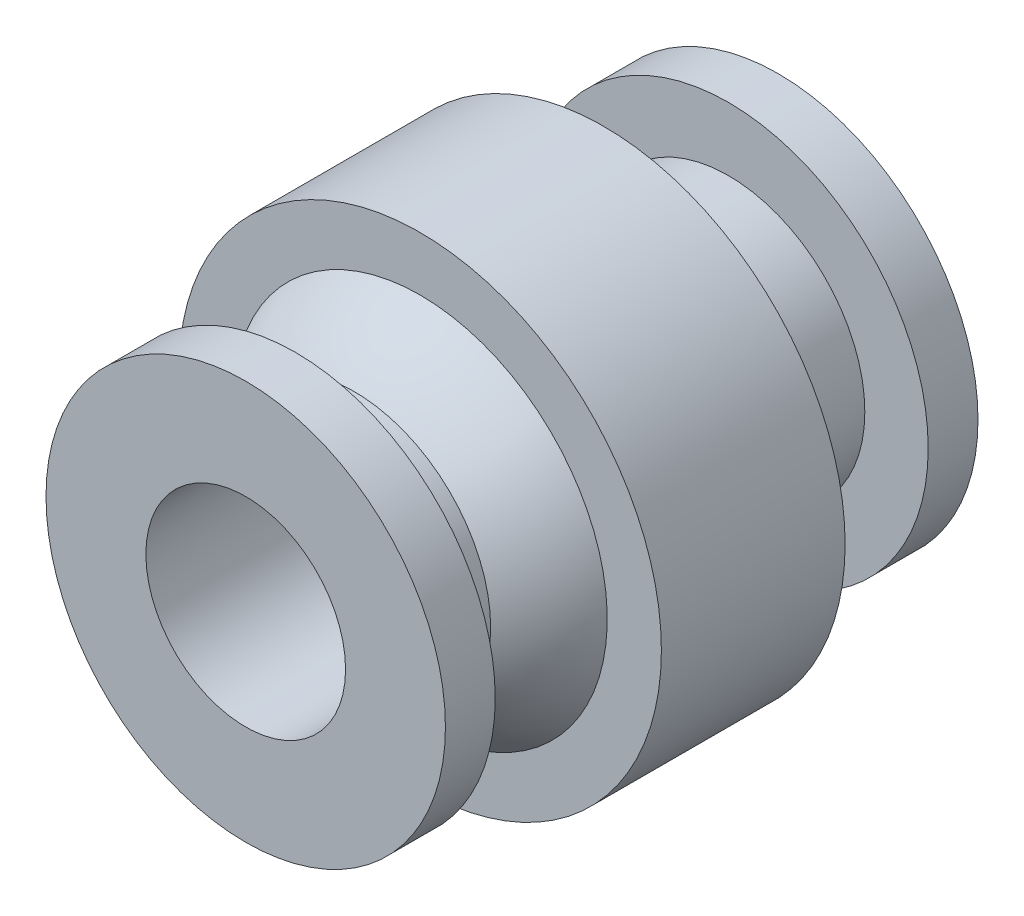
ISO-10303-21;
HEADER;
FILE_DESCRIPTION(('STEP AP214'),'2;1');
FILE_NAME('part.step','',(''),(''),'','','');
FILE_SCHEMA(('AUTOMOTIVE_DESIGN { 1 0 10303 214 1 1 1 1 }'));
ENDSEC;
DATA;
#1=APPLICATION_CONTEXT('core data for automotive mechanical design processes');
#2=APPLICATION_PROTOCOL_DEFINITION('international standard','automotive_design',2000,#1);
#3=PRODUCT_CONTEXT('',#1,'mechanical');
#4=PRODUCT('Part','Part','',(#3));
#5=PRODUCT_RELATED_PRODUCT_CATEGORY('part','',(#4));
#6=PRODUCT_DEFINITION_FORMATION('','',#4);
#7=PRODUCT_DEFINITION_CONTEXT('part definition',#1,'design');
#8=PRODUCT_DEFINITION('design','',#6,#7);
#9=PRODUCT_DEFINITION_SHAPE('','',#8);
#10=(LENGTH_UNIT() NAMED_UNIT(*) SI_UNIT(.MILLI.,.METRE.));
#11=(NAMED_UNIT(*) PLANE_ANGLE_UNIT() SI_UNIT($,.RADIAN.));
#12=(NAMED_UNIT(*) SI_UNIT($,.STERADIAN.) SOLID_ANGLE_UNIT());
#13=UNCERTAINTY_MEASURE_WITH_UNIT(LENGTH_MEASURE(1.E-05),#10,'distance_accuracy_value','');
#14=(GEOMETRIC_REPRESENTATION_CONTEXT(3) GLOBAL_UNCERTAINTY_ASSIGNED_CONTEXT((#13)) GLOBAL_UNIT_ASSIGNED_CONTEXT((#10,
#11,#12)) REPRESENTATION_CONTEXT('',''));
#15=CARTESIAN_POINT('',(0.,0.,0.));
#16=DIRECTION('',(0.,0.,1.));
#17=DIRECTION('',(1.,0.,0.));
#18=AXIS2_PLACEMENT_3D('',#15,#16,#17);
#19=CARTESIAN_POINT('',(0.,-31.574232,-60.7949));
#20=DIRECTION('',(0.,0.,-1.));
#21=DIRECTION('',(-1.,0.,0.));
#22=AXIS2_PLACEMENT_3D('',#19,#20,#21);
#23=PLANE('',#22);
#24=CARTESIAN_POINT('',(0.,-22.049232,-60.7949));
#25=DIRECTION('',(0.,0.,1.));
#26=DIRECTION('',(1.,0.,0.));
#27=AXIS2_PLACEMENT_3D('',#24,#25,#26);
#28=CIRCLE('',#27,6.5024);
#29=CARTESIAN_POINT('',(6.5024,-22.049232,-60.7949));
#30=VERTEX_POINT('',#29);
#31=EDGE_CURVE('E10',#30,#30,#28,.T.);
#32=ORIENTED_EDGE('',*,*,#31,.T.);
#33=EDGE_LOOP('',(#32));
#34=FACE_BOUND('',#33,.T.);
#35=CARTESIAN_POINT('',(0.,-22.049232,-60.7949));
#36=DIRECTION('',(0.,0.,1.));
#37=DIRECTION('',(1.,0.,0.));
#38=AXIS2_PLACEMENT_3D('',#35,#36,#37);
#39=CIRCLE('',#38,9.525);
#40=CARTESIAN_POINT('',(9.525,-22.049232,-60.7949));
#41=VERTEX_POINT('',#40);
#42=EDGE_CURVE('E84',#41,#41,#39,.T.);
#43=ORIENTED_EDGE('',*,*,#42,.F.);
#44=EDGE_LOOP('',(#43));
#45=FACE_BOUND('',#44,.T.);
#46=ADVANCED_FACE('F38',(#34,#45),#23,.T.);
#47=CARTESIAN_POINT('',(0.,-22.049232,-82.1361730867633));
#48=DIRECTION('',(0.,0.,1.));
#49=DIRECTION('',(1.,0.,0.));
#50=AXIS2_PLACEMENT_3D('',#47,#48,#49);
#51=CYLINDRICAL_SURFACE('',#50,6.5024);
#52=CARTESIAN_POINT('',(0.,-22.049232,-63.6000069614774));
#53=DIRECTION('',(0.,0.,1.));
#54=DIRECTION('',(1.,0.,0.));
#55=AXIS2_PLACEMENT_3D('',#52,#53,#54);
#56=CIRCLE('',#55,6.5024);
#57=CARTESIAN_POINT('',(0.,-28.551632,-63.6000069614774));
#58=VERTEX_POINT('',#57);
#59=EDGE_CURVE('E44',#58,#58,#56,.T.);
#60=ORIENTED_EDGE('',*,*,#59,.T.);
#61=EDGE_LOOP('',(#60));
#62=FACE_BOUND('',#61,.T.);
#63=ORIENTED_EDGE('',*,*,#31,.F.);
#64=EDGE_LOOP('',(#63));
#65=FACE_BOUND('',#64,.T.);
#66=ADVANCED_FACE('F92',(#62,#65),#51,.T.);
#67=CARTESIAN_POINT('',(0.,-22.049232,-71.12));
#68=DIRECTION('',(0.,0.,1.));
#69=DIRECTION('',(0.,-1.,0.));
#70=AXIS2_PLACEMENT_3D('',#67,#68,#69);
#71=SPHERICAL_SURFACE('',#70,9.94140337474685);
#72=CARTESIAN_POINT('',(0.,-22.049232,-66.7385));
#73=DIRECTION('',(0.,0.,1.));
#74=DIRECTION('',(1.,0.,0.));
#75=AXIS2_PLACEMENT_3D('',#72,#73,#74);
#76=CIRCLE('',#75,8.92378612526253);
#77=CARTESIAN_POINT('',(0.,-30.9730181252625,-66.7385));
#78=VERTEX_POINT('',#77);
#79=EDGE_CURVE('E48',#78,#78,#76,.T.);
#80=CARTESIAN_POINT('',(0.,-30.9730181252625,-66.7385));
#81=CARTESIAN_POINT('',(0.,-30.9546968172942,-66.7011850210384));
#82=CARTESIAN_POINT('',(0.,-30.9361414336475,-66.6639849715197));
#83=CARTESIAN_POINT('',(0.,-30.8985654926746,-66.5898205560576));
#84=CARTESIAN_POINT('',(0.,-30.8795449353484,-66.5528561901143));
#85=CARTESIAN_POINT('',(0.,-30.8410416246939,-66.4791689664927));
#86=CARTESIAN_POINT('',(0.,-30.8215588713656,-66.4424461088144));
#87=CARTESIAN_POINT('',(0.,-30.7821342387314,-66.3692476784703));
#88=CARTESIAN_POINT('',(0.,-30.7621923594254,-66.3327721058044));
#89=CARTESIAN_POINT('',(0.,-30.7218526118547,-66.2600739859813));
#90=CARTESIAN_POINT('',(0.,-30.7014547435899,-66.2238514388242));
#91=CARTESIAN_POINT('',(0.,-30.6602062282843,-66.1516650699845));
#92=CARTESIAN_POINT('',(0.,-30.6393555812437,-66.115701248302));
#93=CARTESIAN_POINT('',(0.,-30.5972047894432,-66.0440379898545));
#94=CARTESIAN_POINT('',(0.,-30.5759046446834,-66.0083385530896));
#95=CARTESIAN_POINT('',(0.,-30.5328582093371,-65.9372096822646));
#96=CARTESIAN_POINT('',(0.,-30.5111119187507,-65.9017802482044));
#97=CARTESIAN_POINT('',(0.,-30.4671766138237,-65.8311969581013));
#98=CARTESIAN_POINT('',(0.,-30.4449875994832,-65.7960431020582));
#99=CARTESIAN_POINT('',(0.,-30.4001703387966,-65.7260164999317));
#100=CARTESIAN_POINT('',(0.,-30.3775420924505,-65.6911437538483));
#101=CARTESIAN_POINT('',(0.,-30.3318499286185,-65.6216848593482));
#102=CARTESIAN_POINT('',(0.,-30.3087860111326,-65.5870987109315));
#103=CARTESIAN_POINT('',(0.,-30.2622261344462,-65.5182184543714));
#104=CARTESIAN_POINT('',(0.,-30.2387301752457,-65.4839243462281));
#105=CARTESIAN_POINT('',(0.,-30.1913099125428,-65.4156335668651));
#106=CARTESIAN_POINT('',(0.,-30.1673856090403,-65.3816368956454));
#107=CARTESIAN_POINT('',(0.,-30.1191124225522,-65.3139463399739));
#108=CARTESIAN_POINT('',(0.,-30.0947635395665,-65.2802524555222));
#109=CARTESIAN_POINT('',(0.,-30.0456450257438,-65.2131727755835));
#110=CARTESIAN_POINT('',(0.,-30.0208753949069,-65.1797869800965));
#111=CARTESIAN_POINT('',(0.,-29.9709192832243,-65.1133287318019));
#112=CARTESIAN_POINT('',(0.,-29.9457328023786,-65.0802562789943));
#113=CARTESIAN_POINT('',(0.,-29.8949469541182,-65.0144299204645));
#114=CARTESIAN_POINT('',(0.,-29.8693475867035,-64.9816760147422));
#115=CARTESIAN_POINT('',(0.,-29.8177399937179,-64.9164919046612));
#116=CARTESIAN_POINT('',(0.,-29.7917317681471,-64.8840617003024));
#117=CARTESIAN_POINT('',(0.,-29.7393105516018,-64.8195300962874));
#118=CARTESIAN_POINT('',(0.,-29.7128975606273,-64.7874286966313));
#119=CARTESIAN_POINT('',(0.,-29.6596709697226,-64.7235597536191));
#120=CARTESIAN_POINT('',(0.,-29.6328573697924,-64.6917922102631));
#121=CARTESIAN_POINT('',(0.,-29.5788337804654,-64.6285959789114));
#122=CARTESIAN_POINT('',(0.,-29.5516237910686,-64.5971672909158));
#123=CARTESIAN_POINT('',(0.,-29.4968117046751,-64.5346537160218));
#124=CARTESIAN_POINT('',(0.,-29.4692096076784,-64.5035688291235));
#125=CARTESIAN_POINT('',(0.,-29.4136176496549,-64.4417477480594));
#126=CARTESIAN_POINT('',(0.,-29.3856277886281,-64.4110115538935));
#127=CARTESIAN_POINT('',(0.,-29.3292647071351,-64.3498926950573));
#128=CARTESIAN_POINT('',(0.,-29.3008914866688,-64.319510030387));
#129=CARTESIAN_POINT('',(0.,-29.2437661512124,-64.2591030116738));
#130=CARTESIAN_POINT('',(0.,-29.2150140362224,-64.229078657631));
#131=CARTESIAN_POINT('',(0.,-29.157135436264,-64.1693929849136));
#132=CARTESIAN_POINT('',(0.,-29.1280089512957,-64.139731666239));
#133=CARTESIAN_POINT('',(0.,-29.0693861948185,-64.0807767318931));
#134=CARTESIAN_POINT('',(0.,-29.0398899233096,-64.0514831162218));
#135=CARTESIAN_POINT('',(0.,-28.980532235455,-63.9932681975692));
#136=CARTESIAN_POINT('',(0.,-28.9506708191094,-63.964346894588));
#137=CARTESIAN_POINT('',(0.,-28.890587540465,-63.9068811527306));
#138=CARTESIAN_POINT('',(0.,-28.8603656781663,-63.8783367138544));
#139=CARTESIAN_POINT('',(0.,-28.7995662642682,-63.8216291911362));
#140=CARTESIAN_POINT('',(0.,-28.7689887126688,-63.7934661072941));
#141=CARTESIAN_POINT('',(0.,-28.7074827288851,-63.7375257299696));
#142=CARTESIAN_POINT('',(0.,-28.6765542967007,-63.7097484364872));
#143=CARTESIAN_POINT('',(0.,-28.6143514302681,-63.6545839980472));
#144=CARTESIAN_POINT('',(0.,-28.5830769960198,-63.6271968530898));
#145=CARTESIAN_POINT('',(0.,-28.551632,-63.6000069614774));
#146=B_SPLINE_CURVE_WITH_KNOTS('',3,(#80,#81,#82,#83,#84,#85,#86,#87,#88,#89,#90,#91,#92,#93,
#94,#95,#96,#97,#98,#99,#100,#101,#102,#103,#104,#105,#106,#107,#108,#109,#110,#111,#112,#113,
#114,#115,#116,#117,#118,#119,#120,#121,#122,#123,#124,#125,#126,#127,#128,#129,#130,#131,#132,
#133,#134,#135,#136,#137,#138,#139,#140,#141,#142,#143,#144,#145),.UNSPECIFIED.,.F.,.F.,(4,2,2,
2,2,2,2,2,2,2,2,2,2,2,2,2,2,2,2,2,2,2,2,2,2,2,2,2,2,2,2,2,4),(0.,0.124709653743761,
0.249419307487528,0.374128961231285,0.49883861497504,0.62354826871879,0.748257922462551,
0.872967576206311,0.997677229950065,1.12238688369382,1.24709653743757,1.37180619118134,
1.49651584492509,1.62122549866885,1.74593515241261,1.87064480615637,1.99535445990012,
2.12006411364388,2.24477376738763,2.3694834211314,2.49419307487515,2.61890272861891,
2.74361238236267,2.86832203610643,2.99303168985017,3.11774134359393,3.24245099733769,
3.36716065108145,3.4918703048252,3.61657995856896,3.74128961231272,3.86599926605648,
3.99070891980024),.UNSPECIFIED.);
#147=EDGE_CURVE('BSEAM95',#78,#58,#146,.T.);
#148=ORIENTED_EDGE('',*,*,#79,.T.);
#149=ORIENTED_EDGE('',*,*,#59,.F.);
#150=ORIENTED_EDGE('',*,*,#147,.T.);
#151=ORIENTED_EDGE('',*,*,#147,.F.);
#152=EDGE_LOOP('',(#148,#150,#149,#151));
#153=FACE_BOUND('',#152,.T.);
#154=ADVANCED_FACE('F95',(#153),#71,.T.);
#155=CARTESIAN_POINT('',(0.,-30.9730181252625,-66.7385));
#156=DIRECTION('',(0.,0.,1.));
#157=DIRECTION('',(1.,0.,0.));
#158=AXIS2_PLACEMENT_3D('',#155,#156,#157);
#159=PLANE('',#158);
#160=CARTESIAN_POINT('',(0.,-22.049232,-66.7385));
#161=DIRECTION('',(0.,0.,1.));
#162=DIRECTION('',(1.,0.,0.));
#163=AXIS2_PLACEMENT_3D('',#160,#161,#162);
#164=CIRCLE('',#163,11.5062);
#165=CARTESIAN_POINT('',(11.5062,-22.049232,-66.7385));
#166=VERTEX_POINT('',#165);
#167=EDGE_CURVE('E52',#166,#166,#164,.T.);
#168=ORIENTED_EDGE('',*,*,#167,.T.);
#169=EDGE_LOOP('',(#168));
#170=FACE_BOUND('',#169,.T.);
#171=ORIENTED_EDGE('',*,*,#79,.F.);
#172=EDGE_LOOP('',(#171));
#173=FACE_BOUND('',#172,.T.);
#174=ADVANCED_FACE('F98',(#170,#173),#159,.T.);
#175=CARTESIAN_POINT('',(0.,-22.049232,-82.1361730867633));
#176=DIRECTION('',(0.,0.,1.));
#177=DIRECTION('',(1.,0.,0.));
#178=AXIS2_PLACEMENT_3D('',#175,#176,#177);
#179=CYLINDRICAL_SURFACE('',#178,11.5062);
#180=CARTESIAN_POINT('',(0.,-22.049232,-75.5015));
#181=DIRECTION('',(0.,0.,1.));
#182=DIRECTION('',(1.,0.,0.));
#183=AXIS2_PLACEMENT_3D('',#180,#181,#182);
#184=CIRCLE('',#183,11.5062);
#185=CARTESIAN_POINT('',(11.5062,-22.049232,-75.5015));
#186=VERTEX_POINT('',#185);
#187=EDGE_CURVE('E57',#186,#186,#184,.T.);
#188=ORIENTED_EDGE('',*,*,#187,.T.);
#189=EDGE_LOOP('',(#188));
#190=FACE_BOUND('',#189,.T.);
#191=ORIENTED_EDGE('',*,*,#167,.F.);
#192=EDGE_LOOP('',(#191));
#193=FACE_BOUND('',#192,.T.);
#194=ADVANCED_FACE('F105',(#190,#193),#179,.T.);
#195=CARTESIAN_POINT('',(0.,-33.555432,-75.5015));
#196=DIRECTION('',(0.,0.,-1.));
#197=DIRECTION('',(-1.,0.,0.));
#198=AXIS2_PLACEMENT_3D('',#195,#196,#197);
#199=PLANE('',#198);
#200=CARTESIAN_POINT('',(0.,-22.049232,-75.5015));
#201=DIRECTION('',(0.,0.,1.));
#202=DIRECTION('',(1.,0.,0.));
#203=AXIS2_PLACEMENT_3D('',#200,#201,#202);
#204=CIRCLE('',#203,8.92378612526253);
#205=CARTESIAN_POINT('',(0.,-30.9730181252625,-75.5015));
#206=VERTEX_POINT('',#205);
#207=EDGE_CURVE('E60',#206,#206,#204,.T.);
#208=ORIENTED_EDGE('',*,*,#207,.T.);
#209=EDGE_LOOP('',(#208));
#210=FACE_BOUND('',#209,.T.);
#211=ORIENTED_EDGE('',*,*,#187,.F.);
#212=EDGE_LOOP('',(#211));
#213=FACE_BOUND('',#212,.T.);
#214=ADVANCED_FACE('F109',(#210,#213),#199,.T.);
#215=CARTESIAN_POINT('',(0.,-22.049232,-71.12));
#216=DIRECTION('',(0.,0.,1.));
#217=DIRECTION('',(0.,-1.,0.));
#218=AXIS2_PLACEMENT_3D('',#215,#216,#217);
#219=SPHERICAL_SURFACE('',#218,9.94140337474685);
#220=CARTESIAN_POINT('',(0.,-22.049232,-78.6399930385226));
#221=DIRECTION('',(0.,0.,1.));
#222=DIRECTION('',(1.,0.,0.));
#223=AXIS2_PLACEMENT_3D('',#220,#221,#222);
#224=CIRCLE('',#223,6.5024);
#225=CARTESIAN_POINT('',(0.,-28.551632,-78.6399930385226));
#226=VERTEX_POINT('',#225);
#227=EDGE_CURVE('E63',#226,#226,#224,.T.);
#228=CARTESIAN_POINT('',(0.,-28.551632,-78.6399930385226));
#229=CARTESIAN_POINT('',(0.,-28.5830769960198,-78.6128031469102));
#230=CARTESIAN_POINT('',(0.,-28.6143514302681,-78.5854160019528));
#231=CARTESIAN_POINT('',(0.,-28.6765542967007,-78.5302515635128));
#232=CARTESIAN_POINT('',(0.,-28.707482728885,-78.5024742700304));
#233=CARTESIAN_POINT('',(0.,-28.7689887126688,-78.4465338927059));
#234=CARTESIAN_POINT('',(0.,-28.7995662642682,-78.4183708088638));
#235=CARTESIAN_POINT('',(0.,-28.8603656781663,-78.3616632861455));
#236=CARTESIAN_POINT('',(0.,-28.890587540465,-78.3331188472694));
#237=CARTESIAN_POINT('',(0.,-28.9506708191094,-78.275653105412));
#238=CARTESIAN_POINT('',(0.,-28.980532235455,-78.2467318024308));
#239=CARTESIAN_POINT('',(0.,-29.0398899233096,-78.1885168837782));
#240=CARTESIAN_POINT('',(0.,-29.0693861948185,-78.1592232681069));
#241=CARTESIAN_POINT('',(0.,-29.1280089512957,-78.100268333761));
#242=CARTESIAN_POINT('',(0.,-29.157135436264,-78.0706070150864));
#243=CARTESIAN_POINT('',(0.,-29.2150140362223,-78.010921342369));
#244=CARTESIAN_POINT('',(0.,-29.2437661512124,-77.9808969883262));
#245=CARTESIAN_POINT('',(0.,-29.3008914866688,-77.920489969613));
#246=CARTESIAN_POINT('',(0.,-29.3292647071351,-77.8901073049427));
#247=CARTESIAN_POINT('',(0.,-29.3856277886281,-77.8289884461065));
#248=CARTESIAN_POINT('',(0.,-29.4136176496549,-77.7982522519406));
#249=CARTESIAN_POINT('',(0.,-29.4692096076783,-77.7364311708765));
#250=CARTESIAN_POINT('',(0.,-29.4968117046751,-77.7053462839782));
#251=CARTESIAN_POINT('',(0.,-29.5516237910686,-77.6428327090842));
#252=CARTESIAN_POINT('',(0.,-29.5788337804654,-77.6114040210886));
#253=CARTESIAN_POINT('',(0.,-29.6328573697924,-77.5482077897369));
#254=CARTESIAN_POINT('',(0.,-29.6596709697226,-77.5164402463809));
#255=CARTESIAN_POINT('',(0.,-29.7128975606273,-77.4525713033687));
#256=CARTESIAN_POINT('',(0.,-29.7393105516017,-77.4204699037126));
#257=CARTESIAN_POINT('',(0.,-29.791731768147,-77.3559382996976));
#258=CARTESIAN_POINT('',(0.,-29.8177399937179,-77.3235080953388));
#259=CARTESIAN_POINT('',(0.,-29.8693475867035,-77.2583239852578));
#260=CARTESIAN_POINT('',(0.,-29.8949469541182,-77.2255700795355));
#261=CARTESIAN_POINT('',(0.,-29.9457328023786,-77.1597437210056));
#262=CARTESIAN_POINT('',(0.,-29.9709192832243,-77.1266712681981));
#263=CARTESIAN_POINT('',(0.,-30.0208753949069,-77.0602130199035));
#264=CARTESIAN_POINT('',(0.,-30.0456450257438,-77.0268272244165));
#265=CARTESIAN_POINT('',(0.,-30.0947635395665,-76.9597475444778));
#266=CARTESIAN_POINT('',(0.,-30.1191124225522,-76.9260536600261));
#267=CARTESIAN_POINT('',(0.,-30.1673856090403,-76.8583631043546));
#268=CARTESIAN_POINT('',(0.,-30.1913099125428,-76.8243664331349));
#269=CARTESIAN_POINT('',(0.,-30.2387301752457,-76.7560756537719));
#270=CARTESIAN_POINT('',(0.,-30.2622261344462,-76.7217815456286));
#271=CARTESIAN_POINT('',(0.,-30.3087860111326,-76.6529012890685));
#272=CARTESIAN_POINT('',(0.,-30.3318499286185,-76.6183151406518));
#273=CARTESIAN_POINT('',(0.,-30.3775420924505,-76.5488562461517));
#274=CARTESIAN_POINT('',(0.,-30.4001703387966,-76.5139835000683));
#275=CARTESIAN_POINT('',(0.,-30.4449875994832,-76.4439568979418));
#276=CARTESIAN_POINT('',(0.,-30.4671766138237,-76.4088030418987));
#277=CARTESIAN_POINT('',(0.,-30.5111119187507,-76.3382197517955));
#278=CARTESIAN_POINT('',(0.,-30.5328582093371,-76.3027903177354));
#279=CARTESIAN_POINT('',(0.,-30.5759046446834,-76.2316614469104));
#280=CARTESIAN_POINT('',(0.,-30.5972047894432,-76.1959620101455));
#281=CARTESIAN_POINT('',(0.,-30.6393555812437,-76.124298751698));
#282=CARTESIAN_POINT('',(0.,-30.6602062282843,-76.0883349300155));
#283=CARTESIAN_POINT('',(0.,-30.7014547435898,-76.0161485611758));
#284=CARTESIAN_POINT('',(0.,-30.7218526118547,-75.9799260140186));
#285=CARTESIAN_POINT('',(0.,-30.7621923594254,-75.9072278941956));
#286=CARTESIAN_POINT('',(0.,-30.7821342387314,-75.8707523215297));
#287=CARTESIAN_POINT('',(0.,-30.8215588713656,-75.7975538911856));
#288=CARTESIAN_POINT('',(0.,-30.8410416246939,-75.7608310335073));
#289=CARTESIAN_POINT('',(0.,-30.8795449353484,-75.6871438098857));
#290=CARTESIAN_POINT('',(0.,-30.8985654926746,-75.6501794439424));
#291=CARTESIAN_POINT('',(0.,-30.9361414336475,-75.5760150284803));
#292=CARTESIAN_POINT('',(0.,-30.9546968172942,-75.5388149789616));
#293=CARTESIAN_POINT('',(0.,-30.9730181252625,-75.5015));
#294=B_SPLINE_CURVE_WITH_KNOTS('',3,(#228,#229,#230,#231,#232,#233,#234,#235,#236,#237,#238,
#239,#240,#241,#242,#243,#244,#245,#246,#247,#248,#249,#250,#251,#252,#253,#254,#255,#256,#257,
#258,#259,#260,#261,#262,#263,#264,#265,#266,#267,#268,#269,#270,#271,#272,#273,#274,#275,#276,
#277,#278,#279,#280,#281,#282,#283,#284,#285,#286,#287,#288,#289,#290,#291,#292,#293),
.UNSPECIFIED.,.F.,.F.,(4,2,2,2,2,2,2,2,2,2,2,2,2,2,2,2,2,2,2,2,2,2,2,2,2,2,2,2,2,2,2,2,4),(0.,
0.124709653743763,0.249419307487516,0.374128961231278,0.498838614975035,0.623548268718788,
0.748257922462548,0.872967576206305,0.997677229950066,1.12238688369382,1.24709653743757,
1.37180619118134,1.49651584492509,1.62122549866884,1.74593515241261,1.87064480615636,
1.99535445990012,2.12006411364387,2.24477376738764,2.3694834211314,2.49419307487515,
2.61890272861891,2.74361238236267,2.86832203610642,2.99303168985018,3.11774134359393,
3.24245099733769,3.36716065108146,3.49187030482521,3.61657995856897,3.74128961231272,
3.86599926605648,3.99070891980023),.UNSPECIFIED.);
#295=EDGE_CURVE('BSEAM113',#226,#206,#294,.T.);
#296=ORIENTED_EDGE('',*,*,#227,.T.);
#297=ORIENTED_EDGE('',*,*,#207,.F.);
#298=ORIENTED_EDGE('',*,*,#295,.T.);
#299=ORIENTED_EDGE('',*,*,#295,.F.);
#300=EDGE_LOOP('',(#296,#298,#297,#299));
#301=FACE_BOUND('',#300,.T.);
#302=ADVANCED_FACE('F113',(#301),#219,.T.);
#303=CARTESIAN_POINT('',(0.,-22.049232,-82.1361730867633));
#304=DIRECTION('',(0.,0.,1.));
#305=DIRECTION('',(1.,0.,0.));
#306=AXIS2_PLACEMENT_3D('',#303,#304,#305);
#307=CYLINDRICAL_SURFACE('',#306,6.5024);
#308=CARTESIAN_POINT('',(0.,-22.049232,-81.4451));
#309=DIRECTION('',(0.,0.,1.));
#310=DIRECTION('',(1.,0.,0.));
#311=AXIS2_PLACEMENT_3D('',#308,#309,#310);
#312=CIRCLE('',#311,6.5024);
#313=CARTESIAN_POINT('',(6.5024,-22.049232,-81.4451));
#314=VERTEX_POINT('',#313);
#315=EDGE_CURVE('E66',#314,#314,#312,.T.);
#316=ORIENTED_EDGE('',*,*,#315,.T.);
#317=EDGE_LOOP('',(#316));
#318=FACE_BOUND('',#317,.T.);
#319=ORIENTED_EDGE('',*,*,#227,.F.);
#320=EDGE_LOOP('',(#319));
#321=FACE_BOUND('',#320,.T.);
#322=ADVANCED_FACE('F117',(#318,#321),#307,.T.);
#323=CARTESIAN_POINT('',(0.,-28.551632,-81.4451));
#324=DIRECTION('',(0.,0.,1.));
#325=DIRECTION('',(1.,0.,0.));
#326=AXIS2_PLACEMENT_3D('',#323,#324,#325);
#327=PLANE('',#326);
#328=CARTESIAN_POINT('',(0.,-22.049232,-81.4451));
#329=DIRECTION('',(0.,0.,1.));
#330=DIRECTION('',(1.,0.,0.));
#331=AXIS2_PLACEMENT_3D('',#328,#329,#330);
#332=CIRCLE('',#331,9.525);
#333=CARTESIAN_POINT('',(9.525,-22.049232,-81.4451));
#334=VERTEX_POINT('',#333);
#335=EDGE_CURVE('E69',#334,#334,#332,.T.);
#336=ORIENTED_EDGE('',*,*,#335,.T.);
#337=EDGE_LOOP('',(#336));
#338=FACE_BOUND('',#337,.T.);
#339=ORIENTED_EDGE('',*,*,#315,.F.);
#340=EDGE_LOOP('',(#339));
#341=FACE_BOUND('',#340,.T.);
#342=ADVANCED_FACE('F121',(#338,#341),#327,.T.);
#343=CARTESIAN_POINT('',(0.,-22.049232,-82.1361730867633));
#344=DIRECTION('',(0.,0.,1.));
#345=DIRECTION('',(1.,0.,0.));
#346=AXIS2_PLACEMENT_3D('',#343,#344,#345);
#347=CYLINDRICAL_SURFACE('',#346,9.525);
#348=CARTESIAN_POINT('',(0.,-22.049232,-83.82));
#349=DIRECTION('',(0.,0.,1.));
#350=DIRECTION('',(1.,0.,0.));
#351=AXIS2_PLACEMENT_3D('',#348,#349,#350);
#352=CIRCLE('',#351,9.525);
#353=CARTESIAN_POINT('',(9.525,-22.049232,-83.82));
#354=VERTEX_POINT('',#353);
#355=EDGE_CURVE('E72',#354,#354,#352,.T.);
#356=ORIENTED_EDGE('',*,*,#355,.T.);
#357=EDGE_LOOP('',(#356));
#358=FACE_BOUND('',#357,.T.);
#359=ORIENTED_EDGE('',*,*,#335,.F.);
#360=EDGE_LOOP('',(#359));
#361=FACE_BOUND('',#360,.T.);
#362=ADVANCED_FACE('F125',(#358,#361),#347,.T.);
#363=CARTESIAN_POINT('',(0.,-31.574232,-83.82));
#364=DIRECTION('',(0.,0.,-1.));
#365=DIRECTION('',(-1.,0.,0.));
#366=AXIS2_PLACEMENT_3D('',#363,#364,#365);
#367=PLANE('',#366);
#368=CARTESIAN_POINT('',(0.,-22.049232,-83.82));
#369=DIRECTION('',(0.,0.,1.));
#370=DIRECTION('',(1.,0.,0.));
#371=AXIS2_PLACEMENT_3D('',#368,#369,#370);
#372=CIRCLE('',#371,4.7625);
#373=CARTESIAN_POINT('',(4.7625,-22.049232,-83.82));
#374=VERTEX_POINT('',#373);
#375=EDGE_CURVE('E75',#374,#374,#372,.T.);
#376=ORIENTED_EDGE('',*,*,#375,.T.);
#377=EDGE_LOOP('',(#376));
#378=FACE_BOUND('',#377,.T.);
#379=ORIENTED_EDGE('',*,*,#355,.F.);
#380=EDGE_LOOP('',(#379));
#381=FACE_BOUND('',#380,.T.);
#382=ADVANCED_FACE('F129',(#378,#381),#367,.T.);
#383=CARTESIAN_POINT('',(0.,-22.049232,-82.1361730867633));
#384=DIRECTION('',(0.,0.,1.));
#385=DIRECTION('',(1.,0.,0.));
#386=AXIS2_PLACEMENT_3D('',#383,#384,#385);
#387=CYLINDRICAL_SURFACE('',#386,4.7625);
#388=CARTESIAN_POINT('',(0.,-22.049232,-58.42));
#389=DIRECTION('',(0.,0.,1.));
#390=DIRECTION('',(1.,0.,0.));
#391=AXIS2_PLACEMENT_3D('',#388,#389,#390);
#392=CIRCLE('',#391,4.7625);
#393=CARTESIAN_POINT('',(4.7625,-22.049232,-58.42));
#394=VERTEX_POINT('',#393);
#395=EDGE_CURVE('E78',#394,#394,#392,.T.);
#396=ORIENTED_EDGE('',*,*,#395,.T.);
#397=EDGE_LOOP('',(#396));
#398=FACE_BOUND('',#397,.T.);
#399=ORIENTED_EDGE('',*,*,#375,.F.);
#400=EDGE_LOOP('',(#399));
#401=FACE_BOUND('',#400,.T.);
#402=ADVANCED_FACE('F133',(#398,#401),#387,.F.);
#403=CARTESIAN_POINT('',(0.,-26.811732,-58.42));
#404=DIRECTION('',(0.,0.,1.));
#405=DIRECTION('',(1.,0.,0.));
#406=AXIS2_PLACEMENT_3D('',#403,#404,#405);
#407=PLANE('',#406);
#408=CARTESIAN_POINT('',(0.,-22.049232,-58.42));
#409=DIRECTION('',(0.,0.,1.));
#410=DIRECTION('',(1.,0.,0.));
#411=AXIS2_PLACEMENT_3D('',#408,#409,#410);
#412=CIRCLE('',#411,9.525);
#413=CARTESIAN_POINT('',(9.525,-22.049232,-58.42));
#414=VERTEX_POINT('',#413);
#415=EDGE_CURVE('E81',#414,#414,#412,.T.);
#416=ORIENTED_EDGE('',*,*,#415,.T.);
#417=EDGE_LOOP('',(#416));
#418=FACE_BOUND('',#417,.T.);
#419=ORIENTED_EDGE('',*,*,#395,.F.);
#420=EDGE_LOOP('',(#419));
#421=FACE_BOUND('',#420,.T.);
#422=ADVANCED_FACE('F137',(#418,#421),#407,.T.);
#423=CARTESIAN_POINT('',(0.,-22.049232,-82.1361730867633));
#424=DIRECTION('',(0.,0.,1.));
#425=DIRECTION('',(1.,0.,0.));
#426=AXIS2_PLACEMENT_3D('',#423,#424,#425);
#427=CYLINDRICAL_SURFACE('',#426,9.525);
#428=ORIENTED_EDGE('',*,*,#42,.T.);
#429=EDGE_LOOP('',(#428));
#430=FACE_BOUND('',#429,.T.);
#431=ORIENTED_EDGE('',*,*,#415,.F.);
#432=EDGE_LOOP('',(#431));
#433=FACE_BOUND('',#432,.T.);
#434=ADVANCED_FACE('F88',(#430,#433),#427,.T.);
#435=CLOSED_SHELL('',(#46,#66,#154,#174,#194,#214,#302,#322,#342,#362,#382,#402,#422,#434));
#436=MANIFOLD_SOLID_BREP('B2',#435);
#437=ADVANCED_BREP_SHAPE_REPRESENTATION('',(#18,#436),#14);
#438=SHAPE_DEFINITION_REPRESENTATION(#9,#437);
ENDSEC;
END-ISO-10303-21;
